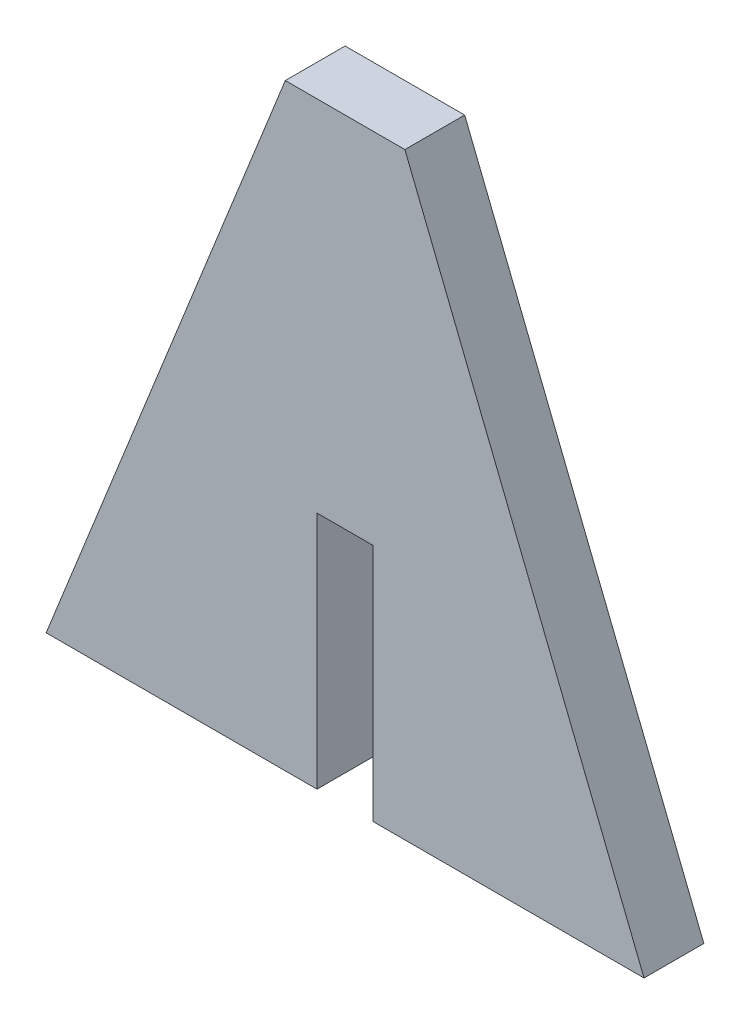
ISO-10303-21;
HEADER;
FILE_DESCRIPTION(('STEP AP214'),'2;1');
FILE_NAME('part.step','',(''),(''),'','','');
FILE_SCHEMA(('AUTOMOTIVE_DESIGN { 1 0 10303 214 1 1 1 1 }'));
ENDSEC;
DATA;
#1=APPLICATION_CONTEXT('core data for automotive mechanical design processes');
#2=APPLICATION_PROTOCOL_DEFINITION('international standard','automotive_design',2000,#1);
#3=PRODUCT_CONTEXT('',#1,'mechanical');
#4=PRODUCT('Part','Part','',(#3));
#5=PRODUCT_RELATED_PRODUCT_CATEGORY('part','',(#4));
#6=PRODUCT_DEFINITION_FORMATION('','',#4);
#7=PRODUCT_DEFINITION_CONTEXT('part definition',#1,'design');
#8=PRODUCT_DEFINITION('design','',#6,#7);
#9=PRODUCT_DEFINITION_SHAPE('','',#8);
#10=(LENGTH_UNIT() NAMED_UNIT(*) SI_UNIT(.MILLI.,.METRE.));
#11=(NAMED_UNIT(*) PLANE_ANGLE_UNIT() SI_UNIT($,.RADIAN.));
#12=(NAMED_UNIT(*) SI_UNIT($,.STERADIAN.) SOLID_ANGLE_UNIT());
#13=UNCERTAINTY_MEASURE_WITH_UNIT(LENGTH_MEASURE(1.E-05),#10,'distance_accuracy_value','');
#14=(GEOMETRIC_REPRESENTATION_CONTEXT(3) GLOBAL_UNCERTAINTY_ASSIGNED_CONTEXT((#13)) GLOBAL_UNIT_ASSIGNED_CONTEXT((#10,
#11,#12)) REPRESENTATION_CONTEXT('',''));
#15=CARTESIAN_POINT('',(0.,0.,0.));
#16=DIRECTION('',(0.,0.,1.));
#17=DIRECTION('',(1.,0.,0.));
#18=AXIS2_PLACEMENT_3D('',#15,#16,#17);
#19=CARTESIAN_POINT('',(2.35,0.,5.));
#20=DIRECTION('',(-1.,0.,0.));
#21=DIRECTION('',(0.,0.,1.));
#22=AXIS2_PLACEMENT_3D('',#19,#20,#21);
#23=PLANE('',#22);
#24=DIRECTION('',(0.,1.,0.));
#25=VECTOR('',#24,1.);
#26=CARTESIAN_POINT('',(2.35,0.,0.));
#27=LINE('',#26,#25);
#28=CARTESIAN_POINT('',(2.35,-25.,0.));
#29=VERTEX_POINT('',#28);
#30=CARTESIAN_POINT('',(2.35,-5.00000000000003,0.));
#31=VERTEX_POINT('',#30);
#32=EDGE_CURVE('E142',#29,#31,#27,.T.);
#33=ORIENTED_EDGE('',*,*,#32,.F.);
#34=DIRECTION('',(0.,0.,-1.));
#35=VECTOR('',#34,1.);
#36=CARTESIAN_POINT('',(2.35,-25.,5.));
#37=LINE('',#36,#35);
#38=CARTESIAN_POINT('',(2.35,-25.,5.));
#39=VERTEX_POINT('',#38);
#40=EDGE_CURVE('E11',#39,#29,#37,.T.);
#41=ORIENTED_EDGE('',*,*,#40,.F.);
#42=DIRECTION('',(0.,1.,0.));
#43=VECTOR('',#42,1.);
#44=CARTESIAN_POINT('',(2.35,0.,5.));
#45=LINE('',#44,#43);
#46=CARTESIAN_POINT('',(2.35,-5.00000000000003,5.));
#47=VERTEX_POINT('',#46);
#48=EDGE_CURVE('E166',#39,#47,#45,.T.);
#49=ORIENTED_EDGE('',*,*,#48,.T.);
#50=DIRECTION('',(0.,0.,-1.));
#51=VECTOR('',#50,1.);
#52=CARTESIAN_POINT('',(2.35,-5.00000000000003,5.));
#53=LINE('',#52,#51);
#54=EDGE_CURVE('E93',#47,#31,#53,.T.);
#55=ORIENTED_EDGE('',*,*,#54,.T.);
#56=EDGE_LOOP('',(#33,#41,#49,#55));
#57=FACE_BOUND('',#56,.T.);
#58=ADVANCED_FACE('F41',(#57),#23,.T.);
#59=CARTESIAN_POINT('',(0.,-25.,5.));
#60=DIRECTION('',(0.,1.,0.));
#61=DIRECTION('',(-1.,0.,0.));
#62=AXIS2_PLACEMENT_3D('',#59,#60,#61);
#63=PLANE('',#62);
#64=DIRECTION('',(1.,0.,0.));
#65=VECTOR('',#64,1.);
#66=CARTESIAN_POINT('',(0.,-25.,0.));
#67=LINE('',#66,#65);
#68=CARTESIAN_POINT('',(25.,-25.,0.));
#69=VERTEX_POINT('',#68);
#70=EDGE_CURVE('E146',#29,#69,#67,.T.);
#71=ORIENTED_EDGE('',*,*,#70,.T.);
#72=DIRECTION('',(0.,0.,-1.));
#73=VECTOR('',#72,1.);
#74=CARTESIAN_POINT('',(25.,-25.,5.));
#75=LINE('',#74,#73);
#76=CARTESIAN_POINT('',(25.,-25.,5.));
#77=VERTEX_POINT('',#76);
#78=EDGE_CURVE('E50',#77,#69,#75,.T.);
#79=ORIENTED_EDGE('',*,*,#78,.F.);
#80=DIRECTION('',(1.,0.,0.));
#81=VECTOR('',#80,1.);
#82=CARTESIAN_POINT('',(0.,-25.,5.));
#83=LINE('',#82,#81);
#84=EDGE_CURVE('E125',#39,#77,#83,.T.);
#85=ORIENTED_EDGE('',*,*,#84,.F.);
#86=ORIENTED_EDGE('',*,*,#40,.T.);
#87=EDGE_LOOP('',(#71,#79,#85,#86));
#88=FACE_BOUND('',#87,.T.);
#89=ADVANCED_FACE('F188',(#88),#63,.F.);
#90=CARTESIAN_POINT('',(12.9310344827586,5.17241379310344,5.));
#91=DIRECTION('',(0.928476690885259,0.371390676354104,0.));
#92=DIRECTION('',(-0.371390676354104,0.928476690885259,0.));
#93=AXIS2_PLACEMENT_3D('',#90,#91,#92);
#94=PLANE('',#93);
#95=DIRECTION('',(0.371390676354104,-0.928476690885259,0.));
#96=VECTOR('',#95,1.);
#97=CARTESIAN_POINT('',(12.9310344827586,5.17241379310344,0.));
#98=LINE('',#97,#96);
#99=CARTESIAN_POINT('',(5.,25.,0.));
#100=VERTEX_POINT('',#99);
#101=EDGE_CURVE('E150',#100,#69,#98,.T.);
#102=ORIENTED_EDGE('',*,*,#101,.F.);
#103=DIRECTION('',(0.,0.,-1.));
#104=VECTOR('',#103,1.);
#105=CARTESIAN_POINT('',(5.,25.,5.));
#106=LINE('',#105,#104);
#107=CARTESIAN_POINT('',(5.,25.,5.));
#108=VERTEX_POINT('',#107);
#109=EDGE_CURVE('E176',#108,#100,#106,.T.);
#110=ORIENTED_EDGE('',*,*,#109,.F.);
#111=DIRECTION('',(0.371390676354104,-0.928476690885259,0.));
#112=VECTOR('',#111,1.);
#113=CARTESIAN_POINT('',(12.9310344827586,5.17241379310344,5.));
#114=LINE('',#113,#112);
#115=EDGE_CURVE('E185',#108,#77,#114,.T.);
#116=ORIENTED_EDGE('',*,*,#115,.T.);
#117=ORIENTED_EDGE('',*,*,#78,.T.);
#118=EDGE_LOOP('',(#102,#110,#116,#117));
#119=FACE_BOUND('',#118,.T.);
#120=ADVANCED_FACE('F183',(#119),#94,.T.);
#121=CARTESIAN_POINT('',(0.,25.,5.));
#122=DIRECTION('',(0.,1.,0.));
#123=DIRECTION('',(0.,0.,1.));
#124=AXIS2_PLACEMENT_3D('',#121,#122,#123);
#125=PLANE('',#124);
#126=DIRECTION('',(1.,0.,0.));
#127=VECTOR('',#126,1.);
#128=CARTESIAN_POINT('',(0.,25.,0.));
#129=LINE('',#128,#127);
#130=CARTESIAN_POINT('',(-5.,25.,0.));
#131=VERTEX_POINT('',#130);
#132=EDGE_CURVE('E154',#131,#100,#129,.T.);
#133=ORIENTED_EDGE('',*,*,#132,.F.);
#134=DIRECTION('',(0.,0.,-1.));
#135=VECTOR('',#134,1.);
#136=CARTESIAN_POINT('',(-5.,25.,5.));
#137=LINE('',#136,#135);
#138=CARTESIAN_POINT('',(-5.,25.,5.));
#139=VERTEX_POINT('',#138);
#140=EDGE_CURVE('E173',#139,#131,#137,.T.);
#141=ORIENTED_EDGE('',*,*,#140,.F.);
#142=DIRECTION('',(1.,0.,0.));
#143=VECTOR('',#142,1.);
#144=CARTESIAN_POINT('',(0.,25.,5.));
#145=LINE('',#144,#143);
#146=EDGE_CURVE('E196',#139,#108,#145,.T.);
#147=ORIENTED_EDGE('',*,*,#146,.T.);
#148=ORIENTED_EDGE('',*,*,#109,.T.);
#149=EDGE_LOOP('',(#133,#141,#147,#148));
#150=FACE_BOUND('',#149,.T.);
#151=ADVANCED_FACE('F194',(#150),#125,.T.);
#152=CARTESIAN_POINT('',(-12.9310344827586,5.17241379310345,5.));
#153=DIRECTION('',(0.928476690885259,-0.371390676354104,0.));
#154=DIRECTION('',(0.371390676354104,0.928476690885259,0.));
#155=AXIS2_PLACEMENT_3D('',#152,#153,#154);
#156=PLANE('',#155);
#157=DIRECTION('',(-0.371390676354104,-0.928476690885259,0.));
#158=VECTOR('',#157,1.);
#159=CARTESIAN_POINT('',(-12.9310344827586,5.17241379310345,0.));
#160=LINE('',#159,#158);
#161=CARTESIAN_POINT('',(-25.,-25.,0.));
#162=VERTEX_POINT('',#161);
#163=EDGE_CURVE('E158',#131,#162,#160,.T.);
#164=ORIENTED_EDGE('',*,*,#163,.T.);
#165=DIRECTION('',(0.,0.,-1.));
#166=VECTOR('',#165,1.);
#167=CARTESIAN_POINT('',(-25.,-25.,5.));
#168=LINE('',#167,#166);
#169=CARTESIAN_POINT('',(-25.,-25.,5.));
#170=VERTEX_POINT('',#169);
#171=EDGE_CURVE('E131',#170,#162,#168,.T.);
#172=ORIENTED_EDGE('',*,*,#171,.F.);
#173=DIRECTION('',(-0.371390676354104,-0.928476690885259,0.));
#174=VECTOR('',#173,1.);
#175=CARTESIAN_POINT('',(-12.9310344827586,5.17241379310345,5.));
#176=LINE('',#175,#174);
#177=EDGE_CURVE('E119',#139,#170,#176,.T.);
#178=ORIENTED_EDGE('',*,*,#177,.F.);
#179=ORIENTED_EDGE('',*,*,#140,.T.);
#180=EDGE_LOOP('',(#164,#172,#178,#179));
#181=FACE_BOUND('',#180,.T.);
#182=ADVANCED_FACE('F214',(#181),#156,.F.);
#183=CARTESIAN_POINT('',(-2.35,-25.,0.));
#184=VERTEX_POINT('',#183);
#185=EDGE_CURVE('E129',#162,#184,#67,.T.);
#186=ORIENTED_EDGE('',*,*,#185,.T.);
#187=DIRECTION('',(0.,0.,-1.));
#188=VECTOR('',#187,1.);
#189=CARTESIAN_POINT('',(-2.35,-25.,5.));
#190=LINE('',#189,#188);
#191=CARTESIAN_POINT('',(-2.35,-25.,5.));
#192=VERTEX_POINT('',#191);
#193=EDGE_CURVE('E126',#192,#184,#190,.T.);
#194=ORIENTED_EDGE('',*,*,#193,.F.);
#195=EDGE_CURVE('E112',#170,#192,#83,.T.);
#196=ORIENTED_EDGE('',*,*,#195,.F.);
#197=ORIENTED_EDGE('',*,*,#171,.T.);
#198=EDGE_LOOP('',(#186,#194,#196,#197));
#199=FACE_BOUND('',#198,.T.);
#200=ADVANCED_FACE('F127',(#199),#63,.F.);
#201=CARTESIAN_POINT('',(-2.35,0.,5.));
#202=DIRECTION('',(-1.,0.,0.));
#203=DIRECTION('',(0.,0.,1.));
#204=AXIS2_PLACEMENT_3D('',#201,#202,#203);
#205=PLANE('',#204);
#206=DIRECTION('',(0.,1.,0.));
#207=VECTOR('',#206,1.);
#208=CARTESIAN_POINT('',(-2.35,0.,0.));
#209=LINE('',#208,#207);
#210=CARTESIAN_POINT('',(-2.35,-5.00000000000003,0.));
#211=VERTEX_POINT('',#210);
#212=EDGE_CURVE('E86',#184,#211,#209,.T.);
#213=ORIENTED_EDGE('',*,*,#212,.T.);
#214=DIRECTION('',(0.,0.,-1.));
#215=VECTOR('',#214,1.);
#216=CARTESIAN_POINT('',(-2.35,-5.00000000000003,5.));
#217=LINE('',#216,#215);
#218=CARTESIAN_POINT('',(-2.35,-5.00000000000003,5.));
#219=VERTEX_POINT('',#218);
#220=EDGE_CURVE('E132',#219,#211,#217,.T.);
#221=ORIENTED_EDGE('',*,*,#220,.F.);
#222=DIRECTION('',(0.,1.,0.));
#223=VECTOR('',#222,1.);
#224=CARTESIAN_POINT('',(-2.35,0.,5.));
#225=LINE('',#224,#223);
#226=EDGE_CURVE('E116',#192,#219,#225,.T.);
#227=ORIENTED_EDGE('',*,*,#226,.F.);
#228=ORIENTED_EDGE('',*,*,#193,.T.);
#229=EDGE_LOOP('',(#213,#221,#227,#228));
#230=FACE_BOUND('',#229,.T.);
#231=ADVANCED_FACE('F134',(#230),#205,.F.);
#232=CARTESIAN_POINT('',(0.,-5.00000000000003,5.));
#233=DIRECTION('',(0.,1.,0.));
#234=DIRECTION('',(0.,0.,1.));
#235=AXIS2_PLACEMENT_3D('',#232,#233,#234);
#236=PLANE('',#235);
#237=DIRECTION('',(1.,0.,0.));
#238=VECTOR('',#237,1.);
#239=CARTESIAN_POINT('',(0.,-5.00000000000003,0.));
#240=LINE('',#239,#238);
#241=EDGE_CURVE('E163',#211,#31,#240,.T.);
#242=ORIENTED_EDGE('',*,*,#241,.T.);
#243=ORIENTED_EDGE('',*,*,#54,.F.);
#244=DIRECTION('',(1.,0.,0.));
#245=VECTOR('',#244,1.);
#246=CARTESIAN_POINT('',(0.,-5.00000000000003,5.));
#247=LINE('',#246,#245);
#248=EDGE_CURVE('E58',#219,#47,#247,.T.);
#249=ORIENTED_EDGE('',*,*,#248,.F.);
#250=ORIENTED_EDGE('',*,*,#220,.T.);
#251=EDGE_LOOP('',(#242,#243,#249,#250));
#252=FACE_BOUND('',#251,.T.);
#253=ADVANCED_FACE('F219',(#252),#236,.F.);
#254=CARTESIAN_POINT('',(0.,0.,5.));
#255=DIRECTION('',(0.,0.,1.));
#256=DIRECTION('',(1.,0.,0.));
#257=AXIS2_PLACEMENT_3D('',#254,#255,#256);
#258=PLANE('',#257);
#259=ORIENTED_EDGE('',*,*,#48,.F.);
#260=ORIENTED_EDGE('',*,*,#84,.T.);
#261=ORIENTED_EDGE('',*,*,#115,.F.);
#262=ORIENTED_EDGE('',*,*,#146,.F.);
#263=ORIENTED_EDGE('',*,*,#177,.T.);
#264=ORIENTED_EDGE('',*,*,#195,.T.);
#265=ORIENTED_EDGE('',*,*,#226,.T.);
#266=ORIENTED_EDGE('',*,*,#248,.T.);
#267=EDGE_LOOP('',(#259,#260,#261,#262,#263,#264,#265,#266));
#268=FACE_BOUND('',#267,.T.);
#269=ADVANCED_FACE('F114',(#268),#258,.T.);
#270=CARTESIAN_POINT('',(0.,0.,0.));
#271=DIRECTION('',(0.,0.,1.));
#272=DIRECTION('',(1.,0.,0.));
#273=AXIS2_PLACEMENT_3D('',#270,#271,#272);
#274=PLANE('',#273);
#275=ORIENTED_EDGE('',*,*,#32,.T.);
#276=ORIENTED_EDGE('',*,*,#241,.F.);
#277=ORIENTED_EDGE('',*,*,#212,.F.);
#278=ORIENTED_EDGE('',*,*,#185,.F.);
#279=ORIENTED_EDGE('',*,*,#163,.F.);
#280=ORIENTED_EDGE('',*,*,#132,.T.);
#281=ORIENTED_EDGE('',*,*,#101,.T.);
#282=ORIENTED_EDGE('',*,*,#70,.F.);
#283=EDGE_LOOP('',(#275,#276,#277,#278,#279,#280,#281,#282));
#284=FACE_BOUND('',#283,.T.);
#285=ADVANCED_FACE('F190',(#284),#274,.F.);
#286=CLOSED_SHELL('',(#58,#89,#120,#151,#182,#200,#231,#253,#269,#285));
#287=MANIFOLD_SOLID_BREP('B2',#286);
#288=ADVANCED_BREP_SHAPE_REPRESENTATION('',(#18,#287),#14);
#289=SHAPE_DEFINITION_REPRESENTATION(#9,#288);
ENDSEC;
END-ISO-10303-21;
